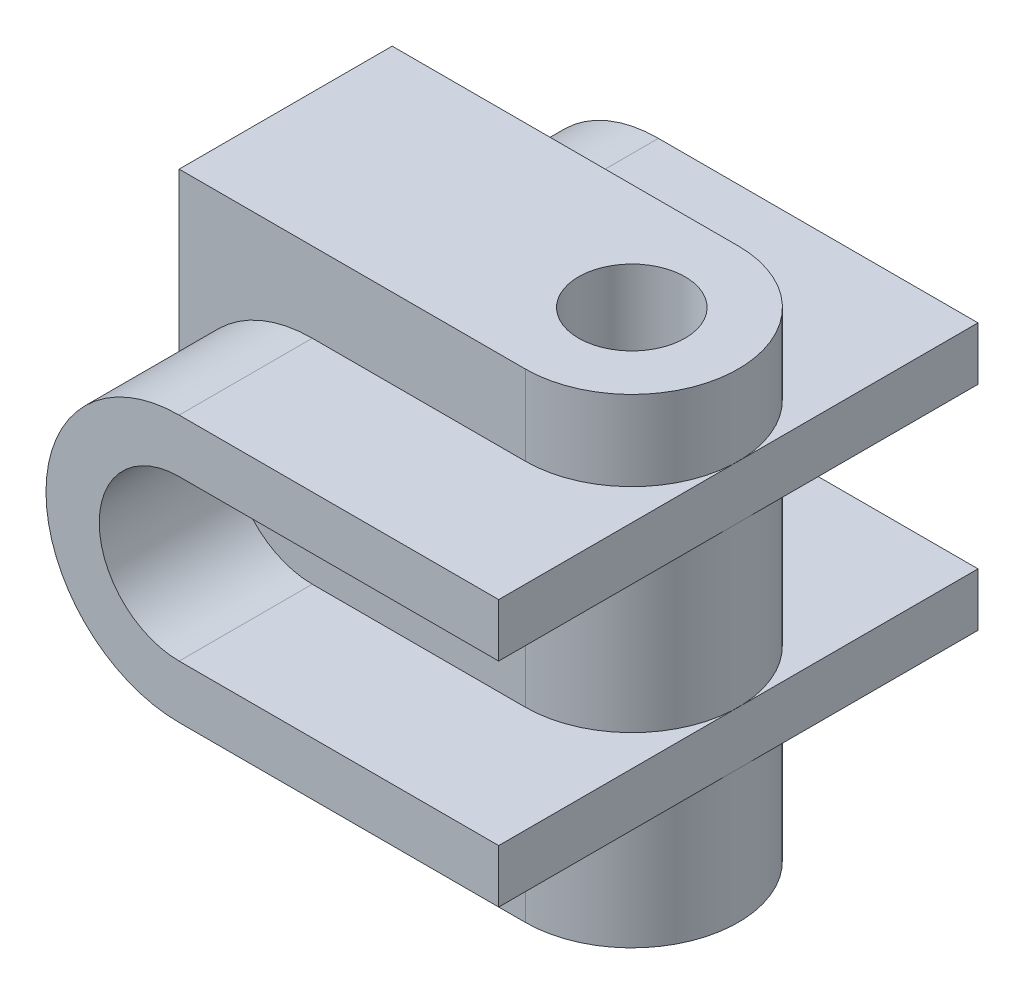
ISO-10303-21;
HEADER;
FILE_DESCRIPTION(('STEP AP214'),'2;1');
FILE_NAME('part.step','',(''),(''),'','','');
FILE_SCHEMA(('AUTOMOTIVE_DESIGN { 1 0 10303 214 1 1 1 1 }'));
ENDSEC;
DATA;
#1=APPLICATION_CONTEXT('core data for automotive mechanical design processes');
#2=APPLICATION_PROTOCOL_DEFINITION('international standard','automotive_design',2000,#1);
#3=PRODUCT_CONTEXT('',#1,'mechanical');
#4=PRODUCT('Part','Part','',(#3));
#5=PRODUCT_RELATED_PRODUCT_CATEGORY('part','',(#4));
#6=PRODUCT_DEFINITION_FORMATION('','',#4);
#7=PRODUCT_DEFINITION_CONTEXT('part definition',#1,'design');
#8=PRODUCT_DEFINITION('design','',#6,#7);
#9=PRODUCT_DEFINITION_SHAPE('','',#8);
#10=(LENGTH_UNIT() NAMED_UNIT(*) SI_UNIT(.MILLI.,.METRE.));
#11=(NAMED_UNIT(*) PLANE_ANGLE_UNIT() SI_UNIT($,.RADIAN.));
#12=(NAMED_UNIT(*) SI_UNIT($,.STERADIAN.) SOLID_ANGLE_UNIT());
#13=UNCERTAINTY_MEASURE_WITH_UNIT(LENGTH_MEASURE(1.E-05),#10,'distance_accuracy_value','');
#14=(GEOMETRIC_REPRESENTATION_CONTEXT(3) GLOBAL_UNCERTAINTY_ASSIGNED_CONTEXT((#13)) GLOBAL_UNIT_ASSIGNED_CONTEXT((#10,
#11,#12)) REPRESENTATION_CONTEXT('',''));
#15=CARTESIAN_POINT('',(0.,0.,0.));
#16=DIRECTION('',(0.,0.,1.));
#17=DIRECTION('',(1.,0.,0.));
#18=AXIS2_PLACEMENT_3D('',#15,#16,#17);
#19=CARTESIAN_POINT('',(-20.,-90.,25.));
#20=DIRECTION('',(0.,0.,-1.));
#21=DIRECTION('',(-1.,0.,0.));
#22=AXIS2_PLACEMENT_3D('',#19,#20,#21);
#23=PLANE('',#22);
#24=DIRECTION('',(-1.,0.,0.));
#25=VECTOR('',#24,1.);
#26=CARTESIAN_POINT('',(-20.,0.,25.));
#27=LINE('',#26,#25);
#28=CARTESIAN_POINT('',(-20.,0.,25.));
#29=VERTEX_POINT('',#28);
#30=CARTESIAN_POINT('',(-85.,0.,25.));
#31=VERTEX_POINT('',#30);
#32=EDGE_CURVE('E123',#29,#31,#27,.T.);
#33=ORIENTED_EDGE('',*,*,#32,.F.);
#34=DIRECTION('',(0.,1.,0.));
#35=VECTOR('',#34,1.);
#36=CARTESIAN_POINT('',(-20.,-90.,25.));
#37=LINE('',#36,#35);
#38=CARTESIAN_POINT('',(-20.,-90.,25.));
#39=VERTEX_POINT('',#38);
#40=EDGE_CURVE('E13',#39,#29,#37,.T.);
#41=ORIENTED_EDGE('',*,*,#40,.F.);
#42=DIRECTION('',(-1.,0.,0.));
#43=VECTOR('',#42,1.);
#44=CARTESIAN_POINT('',(-20.,-90.,25.));
#45=LINE('',#44,#43);
#46=CARTESIAN_POINT('',(-85.,-90.,25.));
#47=VERTEX_POINT('',#46);
#48=EDGE_CURVE('E117',#39,#47,#45,.T.);
#49=ORIENTED_EDGE('',*,*,#48,.T.);
#50=DIRECTION('',(0.,1.,0.));
#51=VECTOR('',#50,1.);
#52=CARTESIAN_POINT('',(-85.,-90.,25.));
#53=LINE('',#52,#51);
#54=EDGE_CURVE('E64',#47,#31,#53,.T.);
#55=ORIENTED_EDGE('',*,*,#54,.T.);
#56=EDGE_LOOP('',(#33,#41,#49,#55));
#57=FACE_BOUND('',#56,.T.);
#58=ADVANCED_FACE('F58',(#57),#23,.T.);
#59=CARTESIAN_POINT('',(-20.,-90.,45.));
#60=DIRECTION('',(0.,1.,0.));
#61=DIRECTION('',(0.,0.,1.));
#62=AXIS2_PLACEMENT_3D('',#59,#60,#61);
#63=CYLINDRICAL_SURFACE('',#62,20.);
#64=CARTESIAN_POINT('',(-20.,0.,45.));
#65=DIRECTION('',(0.,1.,0.));
#66=DIRECTION('',(0.,0.,1.));
#67=AXIS2_PLACEMENT_3D('',#64,#65,#66);
#68=CIRCLE('',#67,20.);
#69=CARTESIAN_POINT('',(-20.,0.,65.));
#70=VERTEX_POINT('',#69);
#71=EDGE_CURVE('E119',#70,#29,#68,.T.);
#72=ORIENTED_EDGE('',*,*,#71,.F.);
#73=DIRECTION('',(0.,1.,0.));
#74=VECTOR('',#73,1.);
#75=CARTESIAN_POINT('',(-20.,-90.,65.));
#76=LINE('',#75,#74);
#77=CARTESIAN_POINT('',(-20.,-90.,65.));
#78=VERTEX_POINT('',#77);
#79=EDGE_CURVE('E68',#78,#70,#76,.T.);
#80=ORIENTED_EDGE('',*,*,#79,.F.);
#81=CARTESIAN_POINT('',(-20.,-90.,45.));
#82=DIRECTION('',(0.,1.,0.));
#83=DIRECTION('',(0.,0.,1.));
#84=AXIS2_PLACEMENT_3D('',#81,#82,#83);
#85=CIRCLE('',#84,20.);
#86=EDGE_CURVE('E114',#78,#39,#85,.T.);
#87=ORIENTED_EDGE('',*,*,#86,.T.);
#88=ORIENTED_EDGE('',*,*,#40,.T.);
#89=EDGE_LOOP('',(#72,#80,#87,#88));
#90=FACE_BOUND('',#89,.T.);
#91=ADVANCED_FACE('F139',(#90),#63,.T.);
#92=CARTESIAN_POINT('',(-85.,-90.,65.));
#93=DIRECTION('',(0.,0.,1.));
#94=DIRECTION('',(1.,0.,0.));
#95=AXIS2_PLACEMENT_3D('',#92,#93,#94);
#96=PLANE('',#95);
#97=DIRECTION('',(1.,0.,0.));
#98=VECTOR('',#97,1.);
#99=CARTESIAN_POINT('',(-85.,0.,65.));
#100=LINE('',#99,#98);
#101=CARTESIAN_POINT('',(-85.,0.,65.));
#102=VERTEX_POINT('',#101);
#103=EDGE_CURVE('E109',#102,#70,#100,.T.);
#104=ORIENTED_EDGE('',*,*,#103,.F.);
#105=DIRECTION('',(0.,1.,0.));
#106=VECTOR('',#105,1.);
#107=CARTESIAN_POINT('',(-85.,-90.,65.));
#108=LINE('',#107,#106);
#109=CARTESIAN_POINT('',(-85.,-90.,65.));
#110=VERTEX_POINT('',#109);
#111=EDGE_CURVE('E102',#110,#102,#108,.T.);
#112=ORIENTED_EDGE('',*,*,#111,.F.);
#113=DIRECTION('',(1.,0.,0.));
#114=VECTOR('',#113,1.);
#115=CARTESIAN_POINT('',(-85.,-90.,65.));
#116=LINE('',#115,#114);
#117=EDGE_CURVE('E108',#110,#78,#116,.T.);
#118=ORIENTED_EDGE('',*,*,#117,.T.);
#119=ORIENTED_EDGE('',*,*,#79,.T.);
#120=EDGE_LOOP('',(#104,#112,#118,#119));
#121=FACE_BOUND('',#120,.T.);
#122=ADVANCED_FACE('F110',(#121),#96,.T.);
#123=CARTESIAN_POINT('',(-85.,-90.,25.));
#124=DIRECTION('',(-1.,0.,0.));
#125=DIRECTION('',(0.,0.,1.));
#126=AXIS2_PLACEMENT_3D('',#123,#124,#125);
#127=PLANE('',#126);
#128=DIRECTION('',(0.,0.,1.));
#129=VECTOR('',#128,1.);
#130=CARTESIAN_POINT('',(-85.,0.,25.));
#131=LINE('',#130,#129);
#132=EDGE_CURVE('E129',#31,#102,#131,.T.);
#133=ORIENTED_EDGE('',*,*,#132,.F.);
#134=ORIENTED_EDGE('',*,*,#54,.F.);
#135=DIRECTION('',(0.,0.,1.));
#136=VECTOR('',#135,1.);
#137=CARTESIAN_POINT('',(-85.,-90.,25.));
#138=LINE('',#137,#136);
#139=EDGE_CURVE('E112',#47,#110,#138,.T.);
#140=ORIENTED_EDGE('',*,*,#139,.T.);
#141=ORIENTED_EDGE('',*,*,#111,.T.);
#142=EDGE_LOOP('',(#133,#134,#140,#141));
#143=FACE_BOUND('',#142,.T.);
#144=ADVANCED_FACE('F120',(#143),#127,.T.);
#145=CARTESIAN_POINT('',(-20.,-90.,45.));
#146=DIRECTION('',(0.,1.,0.));
#147=DIRECTION('',(0.,0.,1.));
#148=AXIS2_PLACEMENT_3D('',#145,#146,#147);
#149=PLANE('',#148);
#150=CARTESIAN_POINT('',(-20.,-90.,45.));
#151=DIRECTION('',(0.,1.,0.));
#152=DIRECTION('',(0.,0.,1.));
#153=AXIS2_PLACEMENT_3D('',#150,#151,#152);
#154=CIRCLE('',#153,10.);
#155=CARTESIAN_POINT('',(-20.,-90.,55.));
#156=VERTEX_POINT('',#155);
#157=EDGE_CURVE('E126',#156,#156,#154,.T.);
#158=ORIENTED_EDGE('',*,*,#157,.T.);
#159=EDGE_LOOP('',(#158));
#160=FACE_BOUND('',#159,.T.);
#161=ORIENTED_EDGE('',*,*,#48,.F.);
#162=ORIENTED_EDGE('',*,*,#86,.F.);
#163=ORIENTED_EDGE('',*,*,#117,.F.);
#164=ORIENTED_EDGE('',*,*,#139,.F.);
#165=EDGE_LOOP('',(#161,#162,#163,#164));
#166=FACE_BOUND('',#165,.T.);
#167=ADVANCED_FACE('F113',(#160,#166),#149,.F.);
#168=CARTESIAN_POINT('',(-20.,-90.,45.));
#169=DIRECTION('',(0.,1.,0.));
#170=DIRECTION('',(0.,0.,1.));
#171=AXIS2_PLACEMENT_3D('',#168,#169,#170);
#172=CYLINDRICAL_SURFACE('',#171,10.);
#173=CARTESIAN_POINT('',(-20.,0.,45.));
#174=DIRECTION('',(0.,1.,0.));
#175=DIRECTION('',(0.,0.,1.));
#176=AXIS2_PLACEMENT_3D('',#173,#174,#175);
#177=CIRCLE('',#176,10.);
#178=CARTESIAN_POINT('',(-20.,0.,55.));
#179=VERTEX_POINT('',#178);
#180=EDGE_CURVE('E162',#179,#179,#177,.T.);
#181=CARTESIAN_POINT('',(-20.,-90.,55.));
#182=CARTESIAN_POINT('',(-20.,-89.0625,55.));
#183=CARTESIAN_POINT('',(-20.,-88.125,55.));
#184=CARTESIAN_POINT('',(-20.,-86.25,55.));
#185=CARTESIAN_POINT('',(-20.,-85.3125,55.));
#186=CARTESIAN_POINT('',(-20.,-83.4375,55.));
#187=CARTESIAN_POINT('',(-20.,-82.5,55.));
#188=CARTESIAN_POINT('',(-20.,-80.625,55.));
#189=CARTESIAN_POINT('',(-20.,-79.6875,55.));
#190=CARTESIAN_POINT('',(-20.,-77.8125,55.));
#191=CARTESIAN_POINT('',(-20.,-76.875,55.));
#192=CARTESIAN_POINT('',(-20.,-75.,55.));
#193=CARTESIAN_POINT('',(-20.,-74.0625,55.));
#194=CARTESIAN_POINT('',(-20.,-72.1875,55.));
#195=CARTESIAN_POINT('',(-20.,-71.25,55.));
#196=CARTESIAN_POINT('',(-20.,-69.375,55.));
#197=CARTESIAN_POINT('',(-20.,-68.4375,55.));
#198=CARTESIAN_POINT('',(-20.,-66.5625,55.));
#199=CARTESIAN_POINT('',(-20.,-65.625,55.));
#200=CARTESIAN_POINT('',(-20.,-63.75,55.));
#201=CARTESIAN_POINT('',(-20.,-62.8125,55.));
#202=CARTESIAN_POINT('',(-20.,-60.9375,55.));
#203=CARTESIAN_POINT('',(-20.,-60.,55.));
#204=CARTESIAN_POINT('',(-20.,-58.125,55.));
#205=CARTESIAN_POINT('',(-20.,-57.1875,55.));
#206=CARTESIAN_POINT('',(-20.,-55.3125,55.));
#207=CARTESIAN_POINT('',(-20.,-54.375,55.));
#208=CARTESIAN_POINT('',(-20.,-52.5,55.));
#209=CARTESIAN_POINT('',(-20.,-51.5625,55.));
#210=CARTESIAN_POINT('',(-20.,-49.6875,55.));
#211=CARTESIAN_POINT('',(-20.,-48.75,55.));
#212=CARTESIAN_POINT('',(-20.,-46.875,55.));
#213=CARTESIAN_POINT('',(-20.,-45.9375,55.));
#214=CARTESIAN_POINT('',(-20.,-44.0625,55.));
#215=CARTESIAN_POINT('',(-20.,-43.125,55.));
#216=CARTESIAN_POINT('',(-20.,-41.25,55.));
#217=CARTESIAN_POINT('',(-20.,-40.3125,55.));
#218=CARTESIAN_POINT('',(-20.,-38.4375,55.));
#219=CARTESIAN_POINT('',(-20.,-37.5,55.));
#220=CARTESIAN_POINT('',(-20.,-35.625,55.));
#221=CARTESIAN_POINT('',(-20.,-34.6875,55.));
#222=CARTESIAN_POINT('',(-20.,-32.8125,55.));
#223=CARTESIAN_POINT('',(-20.,-31.875,55.));
#224=CARTESIAN_POINT('',(-20.,-30.,55.));
#225=CARTESIAN_POINT('',(-20.,-29.0625,55.));
#226=CARTESIAN_POINT('',(-20.,-27.1875,55.));
#227=CARTESIAN_POINT('',(-20.,-26.25,55.));
#228=CARTESIAN_POINT('',(-20.,-24.375,55.));
#229=CARTESIAN_POINT('',(-20.,-23.4375,55.));
#230=CARTESIAN_POINT('',(-20.,-21.5625,55.));
#231=CARTESIAN_POINT('',(-20.,-20.625,55.));
#232=CARTESIAN_POINT('',(-20.,-18.75,55.));
#233=CARTESIAN_POINT('',(-20.,-17.8125,55.));
#234=CARTESIAN_POINT('',(-20.,-15.9375,55.));
#235=CARTESIAN_POINT('',(-20.,-15.,55.));
#236=CARTESIAN_POINT('',(-20.,-13.125,55.));
#237=CARTESIAN_POINT('',(-20.,-12.1875,55.));
#238=CARTESIAN_POINT('',(-20.,-10.3125,55.));
#239=CARTESIAN_POINT('',(-20.,-9.37500000000001,55.));
#240=CARTESIAN_POINT('',(-20.,-7.50000000000002,55.));
#241=CARTESIAN_POINT('',(-20.,-6.56250000000002,55.));
#242=CARTESIAN_POINT('',(-20.,-4.68750000000002,55.));
#243=CARTESIAN_POINT('',(-20.,-3.75000000000001,55.));
#244=CARTESIAN_POINT('',(-20.,-1.87500000000001,55.));
#245=CARTESIAN_POINT('',(-20.,-0.937500000000014,55.));
#246=CARTESIAN_POINT('',(-20.,0.,55.));
#247=B_SPLINE_CURVE_WITH_KNOTS('',3,(#181,#182,#183,#184,#185,#186,#187,#188,#189,#190,#191,
#192,#193,#194,#195,#196,#197,#198,#199,#200,#201,#202,#203,#204,#205,#206,#207,#208,#209,#210,
#211,#212,#213,#214,#215,#216,#217,#218,#219,#220,#221,#222,#223,#224,#225,#226,#227,#228,#229,
#230,#231,#232,#233,#234,#235,#236,#237,#238,#239,#240,#241,#242,#243,#244,#245,#246),
.UNSPECIFIED.,.F.,.F.,(4,2,2,2,2,2,2,2,2,2,2,2,2,2,2,2,2,2,2,2,2,2,2,2,2,2,2,2,2,2,2,2,4),(0.,
2.81250000000001,5.62500000000001,8.4375,11.25,14.0625,16.875,19.6875,22.5,25.3125,28.125,
30.9375,33.75,36.5625,39.375,42.1875,45.,47.8125,50.625,53.4375,56.25,59.0625,61.875,64.6875,
67.5,70.3125,73.125,75.9375,78.75,81.5625,84.375,87.1875,90.),.UNSPECIFIED.);
#248=EDGE_CURVE('BSEAM147',#156,#179,#247,.T.);
#249=ORIENTED_EDGE('',*,*,#157,.F.);
#250=ORIENTED_EDGE('',*,*,#180,.T.);
#251=ORIENTED_EDGE('',*,*,#248,.T.);
#252=ORIENTED_EDGE('',*,*,#248,.F.);
#253=EDGE_LOOP('',(#249,#251,#250,#252));
#254=FACE_BOUND('',#253,.T.);
#255=ADVANCED_FACE('F147',(#254),#172,.F.);
#256=CARTESIAN_POINT('',(-20.,0.,45.));
#257=DIRECTION('',(0.,1.,0.));
#258=DIRECTION('',(0.,0.,1.));
#259=AXIS2_PLACEMENT_3D('',#256,#257,#258);
#260=PLANE('',#259);
#261=ORIENTED_EDGE('',*,*,#180,.F.);
#262=EDGE_LOOP('',(#261));
#263=FACE_BOUND('',#262,.T.);
#264=ORIENTED_EDGE('',*,*,#32,.T.);
#265=ORIENTED_EDGE('',*,*,#132,.T.);
#266=ORIENTED_EDGE('',*,*,#103,.T.);
#267=ORIENTED_EDGE('',*,*,#71,.T.);
#268=EDGE_LOOP('',(#264,#265,#266,#267));
#269=FACE_BOUND('',#268,.T.);
#270=ADVANCED_FACE('F135',(#263,#269),#260,.T.);
#271=CLOSED_SHELL('',(#58,#91,#122,#144,#167,#255,#270));
#272=MANIFOLD_SOLID_BREP('B2',#271);
#273=CARTESIAN_POINT('',(-60.,-65.,90.));
#274=DIRECTION('',(0.,1.,0.));
#275=DIRECTION('',(-1.,0.,0.));
#276=AXIS2_PLACEMENT_3D('',#273,#274,#275);
#277=PLANE('',#276);
#278=DIRECTION('',(1.,0.,0.));
#279=VECTOR('',#278,1.);
#280=CARTESIAN_POINT('',(-60.,-65.,0.));
#281=LINE('',#280,#279);
#282=CARTESIAN_POINT('',(-60.,-65.,0.));
#283=VERTEX_POINT('',#282);
#284=CARTESIAN_POINT('',(0.,-65.,0.));
#285=VERTEX_POINT('',#284);
#286=EDGE_CURVE('E337',#283,#285,#281,.T.);
#287=ORIENTED_EDGE('',*,*,#286,.T.);
#288=DIRECTION('',(0.,0.,-1.));
#289=VECTOR('',#288,1.);
#290=CARTESIAN_POINT('',(0.,-65.,90.));
#291=LINE('',#290,#289);
#292=CARTESIAN_POINT('',(0.,-65.,90.));
#293=VERTEX_POINT('',#292);
#294=EDGE_CURVE('E59',#293,#285,#291,.T.);
#295=ORIENTED_EDGE('',*,*,#294,.F.);
#296=DIRECTION('',(1.,0.,0.));
#297=VECTOR('',#296,1.);
#298=CARTESIAN_POINT('',(-60.,-65.,90.));
#299=LINE('',#298,#297);
#300=CARTESIAN_POINT('',(-60.,-65.,90.));
#301=VERTEX_POINT('',#300);
#302=EDGE_CURVE('E295',#301,#293,#299,.T.);
#303=ORIENTED_EDGE('',*,*,#302,.F.);
#304=DIRECTION('',(0.,0.,-1.));
#305=VECTOR('',#304,1.);
#306=CARTESIAN_POINT('',(-60.,-65.,90.));
#307=LINE('',#306,#305);
#308=EDGE_CURVE('E332',#301,#283,#307,.T.);
#309=ORIENTED_EDGE('',*,*,#308,.T.);
#310=EDGE_LOOP('',(#287,#295,#303,#309));
#311=FACE_BOUND('',#310,.T.);
#312=ADVANCED_FACE('F237',(#311),#277,.F.);
#313=CARTESIAN_POINT('',(0.,-55.,90.));
#314=DIRECTION('',(1.,0.,0.));
#315=DIRECTION('',(0.,1.,0.));
#316=AXIS2_PLACEMENT_3D('',#313,#314,#315);
#317=PLANE('',#316);
#318=DIRECTION('',(0.,-1.,0.));
#319=VECTOR('',#318,1.);
#320=CARTESIAN_POINT('',(0.,-55.,0.));
#321=LINE('',#320,#319);
#322=CARTESIAN_POINT('',(0.,-55.,0.));
#323=VERTEX_POINT('',#322);
#324=EDGE_CURVE('E339',#323,#285,#321,.T.);
#325=ORIENTED_EDGE('',*,*,#324,.F.);
#326=DIRECTION('',(0.,0.,-1.));
#327=VECTOR('',#326,1.);
#328=CARTESIAN_POINT('',(0.,-55.,90.));
#329=LINE('',#328,#327);
#330=CARTESIAN_POINT('',(0.,-55.,90.));
#331=VERTEX_POINT('',#330);
#332=EDGE_CURVE('E250',#331,#323,#329,.T.);
#333=ORIENTED_EDGE('',*,*,#332,.F.);
#334=DIRECTION('',(0.,-1.,0.));
#335=VECTOR('',#334,1.);
#336=CARTESIAN_POINT('',(0.,-55.,90.));
#337=LINE('',#336,#335);
#338=EDGE_CURVE('E377',#331,#293,#337,.T.);
#339=ORIENTED_EDGE('',*,*,#338,.T.);
#340=ORIENTED_EDGE('',*,*,#294,.T.);
#341=EDGE_LOOP('',(#325,#333,#339,#340));
#342=FACE_BOUND('',#341,.T.);
#343=ADVANCED_FACE('F367',(#342),#317,.T.);
#344=CARTESIAN_POINT('',(-60.,-55.,90.));
#345=DIRECTION('',(0.,1.,0.));
#346=DIRECTION('',(-1.,0.,0.));
#347=AXIS2_PLACEMENT_3D('',#344,#345,#346);
#348=PLANE('',#347);
#349=DIRECTION('',(1.,0.,0.));
#350=VECTOR('',#349,1.);
#351=CARTESIAN_POINT('',(-60.,-55.,0.));
#352=LINE('',#351,#350);
#353=CARTESIAN_POINT('',(-60.,-55.,0.));
#354=VERTEX_POINT('',#353);
#355=EDGE_CURVE('E345',#354,#323,#352,.T.);
#356=ORIENTED_EDGE('',*,*,#355,.F.);
#357=DIRECTION('',(0.,0.,-1.));
#358=VECTOR('',#357,1.);
#359=CARTESIAN_POINT('',(-60.,-55.,90.));
#360=LINE('',#359,#358);
#361=CARTESIAN_POINT('',(-60.,-55.,90.));
#362=VERTEX_POINT('',#361);
#363=EDGE_CURVE('E360',#362,#354,#360,.T.);
#364=ORIENTED_EDGE('',*,*,#363,.F.);
#365=DIRECTION('',(1.,0.,0.));
#366=VECTOR('',#365,1.);
#367=CARTESIAN_POINT('',(-60.,-55.,90.));
#368=LINE('',#367,#366);
#369=EDGE_CURVE('E366',#362,#331,#368,.T.);
#370=ORIENTED_EDGE('',*,*,#369,.T.);
#371=ORIENTED_EDGE('',*,*,#332,.T.);
#372=EDGE_LOOP('',(#356,#364,#370,#371));
#373=FACE_BOUND('',#372,.T.);
#374=ADVANCED_FACE('F364',(#373),#348,.T.);
#375=CARTESIAN_POINT('',(-60.,-40.,90.));
#376=DIRECTION('',(0.,0.,-1.));
#377=DIRECTION('',(-1.,0.,0.));
#378=AXIS2_PLACEMENT_3D('',#375,#376,#377);
#379=CYLINDRICAL_SURFACE('',#378,15.);
#380=CARTESIAN_POINT('',(-60.,-40.,0.));
#381=DIRECTION('',(0.,0.,1.));
#382=DIRECTION('',(1.,0.,0.));
#383=AXIS2_PLACEMENT_3D('',#380,#381,#382);
#384=CIRCLE('',#383,15.);
#385=CARTESIAN_POINT('',(-60.,-25.,0.));
#386=VERTEX_POINT('',#385);
#387=EDGE_CURVE('E343',#386,#354,#384,.T.);
#388=ORIENTED_EDGE('',*,*,#387,.F.);
#389=DIRECTION('',(0.,0.,-1.));
#390=VECTOR('',#389,1.);
#391=CARTESIAN_POINT('',(-60.,-25.,90.));
#392=LINE('',#391,#390);
#393=CARTESIAN_POINT('',(-60.,-25.,90.));
#394=VERTEX_POINT('',#393);
#395=EDGE_CURVE('E357',#394,#386,#392,.T.);
#396=ORIENTED_EDGE('',*,*,#395,.F.);
#397=CARTESIAN_POINT('',(-60.,-40.,90.));
#398=DIRECTION('',(0.,0.,1.));
#399=DIRECTION('',(1.,0.,0.));
#400=AXIS2_PLACEMENT_3D('',#397,#398,#399);
#401=CIRCLE('',#400,15.);
#402=EDGE_CURVE('E330',#394,#362,#401,.T.);
#403=ORIENTED_EDGE('',*,*,#402,.T.);
#404=ORIENTED_EDGE('',*,*,#363,.T.);
#405=EDGE_LOOP('',(#388,#396,#403,#404));
#406=FACE_BOUND('',#405,.T.);
#407=ADVANCED_FACE('F376',(#406),#379,.F.);
#408=CARTESIAN_POINT('',(0.,-25.,90.));
#409=DIRECTION('',(0.,-1.,0.));
#410=DIRECTION('',(1.,0.,0.));
#411=AXIS2_PLACEMENT_3D('',#408,#409,#410);
#412=PLANE('',#411);
#413=DIRECTION('',(-1.,0.,0.));
#414=VECTOR('',#413,1.);
#415=CARTESIAN_POINT('',(0.,-25.,0.));
#416=LINE('',#415,#414);
#417=CARTESIAN_POINT('',(0.,-25.,0.));
#418=VERTEX_POINT('',#417);
#419=EDGE_CURVE('E349',#418,#386,#416,.T.);
#420=ORIENTED_EDGE('',*,*,#419,.F.);
#421=DIRECTION('',(0.,0.,-1.));
#422=VECTOR('',#421,1.);
#423=CARTESIAN_POINT('',(0.,-25.,90.));
#424=LINE('',#423,#422);
#425=CARTESIAN_POINT('',(0.,-25.,90.));
#426=VERTEX_POINT('',#425);
#427=EDGE_CURVE('E319',#426,#418,#424,.T.);
#428=ORIENTED_EDGE('',*,*,#427,.F.);
#429=DIRECTION('',(-1.,0.,0.));
#430=VECTOR('',#429,1.);
#431=CARTESIAN_POINT('',(0.,-25.,90.));
#432=LINE('',#431,#430);
#433=EDGE_CURVE('E329',#426,#394,#432,.T.);
#434=ORIENTED_EDGE('',*,*,#433,.T.);
#435=ORIENTED_EDGE('',*,*,#395,.T.);
#436=EDGE_LOOP('',(#420,#428,#434,#435));
#437=FACE_BOUND('',#436,.T.);
#438=ADVANCED_FACE('F384',(#437),#412,.T.);
#439=CARTESIAN_POINT('',(0.,-15.,90.));
#440=DIRECTION('',(1.,0.,0.));
#441=DIRECTION('',(0.,1.,0.));
#442=AXIS2_PLACEMENT_3D('',#439,#440,#441);
#443=PLANE('',#442);
#444=DIRECTION('',(0.,-1.,0.));
#445=VECTOR('',#444,1.);
#446=CARTESIAN_POINT('',(0.,-15.,0.));
#447=LINE('',#446,#445);
#448=CARTESIAN_POINT('',(0.,-15.,0.));
#449=VERTEX_POINT('',#448);
#450=EDGE_CURVE('E320',#449,#418,#447,.T.);
#451=ORIENTED_EDGE('',*,*,#450,.F.);
#452=DIRECTION('',(0.,0.,-1.));
#453=VECTOR('',#452,1.);
#454=CARTESIAN_POINT('',(0.,-15.,90.));
#455=LINE('',#454,#453);
#456=CARTESIAN_POINT('',(0.,-15.,90.));
#457=VERTEX_POINT('',#456);
#458=EDGE_CURVE('E311',#457,#449,#455,.T.);
#459=ORIENTED_EDGE('',*,*,#458,.F.);
#460=DIRECTION('',(0.,-1.,0.));
#461=VECTOR('',#460,1.);
#462=CARTESIAN_POINT('',(0.,-15.,90.));
#463=LINE('',#462,#461);
#464=EDGE_CURVE('E314',#457,#426,#463,.T.);
#465=ORIENTED_EDGE('',*,*,#464,.T.);
#466=ORIENTED_EDGE('',*,*,#427,.T.);
#467=EDGE_LOOP('',(#451,#459,#465,#466));
#468=FACE_BOUND('',#467,.T.);
#469=ADVANCED_FACE('F312',(#468),#443,.T.);
#470=CARTESIAN_POINT('',(0.,-15.,90.));
#471=DIRECTION('',(0.,-1.,0.));
#472=DIRECTION('',(1.,0.,0.));
#473=AXIS2_PLACEMENT_3D('',#470,#471,#472);
#474=PLANE('',#473);
#475=DIRECTION('',(-1.,0.,0.));
#476=VECTOR('',#475,1.);
#477=CARTESIAN_POINT('',(0.,-15.,0.));
#478=LINE('',#477,#476);
#479=CARTESIAN_POINT('',(-60.,-15.,0.));
#480=VERTEX_POINT('',#479);
#481=EDGE_CURVE('E282',#449,#480,#478,.T.);
#482=ORIENTED_EDGE('',*,*,#481,.T.);
#483=DIRECTION('',(0.,0.,-1.));
#484=VECTOR('',#483,1.);
#485=CARTESIAN_POINT('',(-60.,-15.,90.));
#486=LINE('',#485,#484);
#487=CARTESIAN_POINT('',(-60.,-15.,90.));
#488=VERTEX_POINT('',#487);
#489=EDGE_CURVE('E316',#488,#480,#486,.T.);
#490=ORIENTED_EDGE('',*,*,#489,.F.);
#491=DIRECTION('',(-1.,0.,0.));
#492=VECTOR('',#491,1.);
#493=CARTESIAN_POINT('',(0.,-15.,90.));
#494=LINE('',#493,#492);
#495=EDGE_CURVE('E322',#457,#488,#494,.T.);
#496=ORIENTED_EDGE('',*,*,#495,.F.);
#497=ORIENTED_EDGE('',*,*,#458,.T.);
#498=EDGE_LOOP('',(#482,#490,#496,#497));
#499=FACE_BOUND('',#498,.T.);
#500=ADVANCED_FACE('F325',(#499),#474,.F.);
#501=CARTESIAN_POINT('',(-60.,-40.,90.));
#502=DIRECTION('',(0.,0.,-1.));
#503=DIRECTION('',(-1.,0.,0.));
#504=AXIS2_PLACEMENT_3D('',#501,#502,#503);
#505=CYLINDRICAL_SURFACE('',#504,25.);
#506=CARTESIAN_POINT('',(-60.,-40.,0.));
#507=DIRECTION('',(0.,0.,1.));
#508=DIRECTION('',(1.,0.,0.));
#509=AXIS2_PLACEMENT_3D('',#506,#507,#508);
#510=CIRCLE('',#509,25.);
#511=EDGE_CURVE('E290',#480,#283,#510,.T.);
#512=ORIENTED_EDGE('',*,*,#511,.T.);
#513=ORIENTED_EDGE('',*,*,#308,.F.);
#514=CARTESIAN_POINT('',(-60.,-40.,90.));
#515=DIRECTION('',(0.,0.,1.));
#516=DIRECTION('',(1.,0.,0.));
#517=AXIS2_PLACEMENT_3D('',#514,#515,#516);
#518=CIRCLE('',#517,25.);
#519=EDGE_CURVE('E253',#488,#301,#518,.T.);
#520=ORIENTED_EDGE('',*,*,#519,.F.);
#521=ORIENTED_EDGE('',*,*,#489,.T.);
#522=EDGE_LOOP('',(#512,#513,#520,#521));
#523=FACE_BOUND('',#522,.T.);
#524=ADVANCED_FACE('F383',(#523),#505,.T.);
#525=CARTESIAN_POINT('',(-60.,-40.,90.));
#526=DIRECTION('',(0.,0.,1.));
#527=DIRECTION('',(1.,0.,0.));
#528=AXIS2_PLACEMENT_3D('',#525,#526,#527);
#529=PLANE('',#528);
#530=ORIENTED_EDGE('',*,*,#302,.T.);
#531=ORIENTED_EDGE('',*,*,#338,.F.);
#532=ORIENTED_EDGE('',*,*,#369,.F.);
#533=ORIENTED_EDGE('',*,*,#402,.F.);
#534=ORIENTED_EDGE('',*,*,#433,.F.);
#535=ORIENTED_EDGE('',*,*,#464,.F.);
#536=ORIENTED_EDGE('',*,*,#495,.T.);
#537=ORIENTED_EDGE('',*,*,#519,.T.);
#538=EDGE_LOOP('',(#530,#531,#532,#533,#534,#535,#536,#537));
#539=FACE_BOUND('',#538,.T.);
#540=ADVANCED_FACE('F323',(#539),#529,.T.);
#541=CARTESIAN_POINT('',(-60.,-40.,0.));
#542=DIRECTION('',(0.,0.,1.));
#543=DIRECTION('',(1.,0.,0.));
#544=AXIS2_PLACEMENT_3D('',#541,#542,#543);
#545=PLANE('',#544);
#546=ORIENTED_EDGE('',*,*,#286,.F.);
#547=ORIENTED_EDGE('',*,*,#511,.F.);
#548=ORIENTED_EDGE('',*,*,#481,.F.);
#549=ORIENTED_EDGE('',*,*,#450,.T.);
#550=ORIENTED_EDGE('',*,*,#419,.T.);
#551=ORIENTED_EDGE('',*,*,#387,.T.);
#552=ORIENTED_EDGE('',*,*,#355,.T.);
#553=ORIENTED_EDGE('',*,*,#324,.T.);
#554=EDGE_LOOP('',(#546,#547,#548,#549,#550,#551,#552,#553));
#555=FACE_BOUND('',#554,.T.);
#556=ADVANCED_FACE('F375',(#555),#545,.F.);
#557=CLOSED_SHELL('',(#312,#343,#374,#407,#438,#469,#500,#524,#540,#556));
#558=MANIFOLD_SOLID_BREP('B7',#557);
#559=ADVANCED_BREP_SHAPE_REPRESENTATION('',(#18,#272,#558),#14);
#560=SHAPE_DEFINITION_REPRESENTATION(#9,#559);
ENDSEC;
END-ISO-10303-21;
